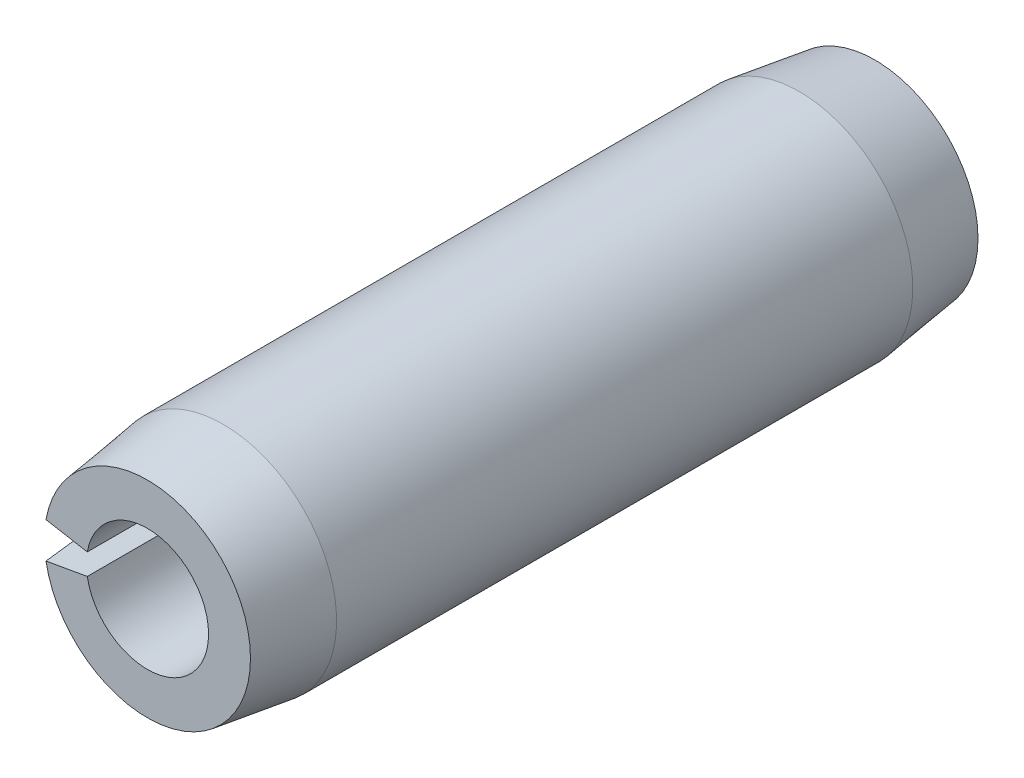
ISO-10303-21;
HEADER;
FILE_DESCRIPTION(('STEP AP214'),'2;1');
FILE_NAME('part.step','',(''),(''),'','','');
FILE_SCHEMA(('AUTOMOTIVE_DESIGN { 1 0 10303 214 1 1 1 1 }'));
ENDSEC;
DATA;
#1=APPLICATION_CONTEXT('core data for automotive mechanical design processes');
#2=APPLICATION_PROTOCOL_DEFINITION('international standard','automotive_design',2000,#1);
#3=PRODUCT_CONTEXT('',#1,'mechanical');
#4=PRODUCT('Part','Part','',(#3));
#5=PRODUCT_RELATED_PRODUCT_CATEGORY('part','',(#4));
#6=PRODUCT_DEFINITION_FORMATION('','',#4);
#7=PRODUCT_DEFINITION_CONTEXT('part definition',#1,'design');
#8=PRODUCT_DEFINITION('design','',#6,#7);
#9=PRODUCT_DEFINITION_SHAPE('','',#8);
#10=(LENGTH_UNIT() NAMED_UNIT(*) SI_UNIT(.MILLI.,.METRE.));
#11=(NAMED_UNIT(*) PLANE_ANGLE_UNIT() SI_UNIT($,.RADIAN.));
#12=(NAMED_UNIT(*) SI_UNIT($,.STERADIAN.) SOLID_ANGLE_UNIT());
#13=UNCERTAINTY_MEASURE_WITH_UNIT(LENGTH_MEASURE(1.E-05),#10,'distance_accuracy_value','');
#14=(GEOMETRIC_REPRESENTATION_CONTEXT(3) GLOBAL_UNCERTAINTY_ASSIGNED_CONTEXT((#13)) GLOBAL_UNIT_ASSIGNED_CONTEXT((#10,
#11,#12)) REPRESENTATION_CONTEXT('',''));
#15=CARTESIAN_POINT('',(0.,0.,0.));
#16=DIRECTION('',(0.,0.,1.));
#17=DIRECTION('',(1.,0.,0.));
#18=AXIS2_PLACEMENT_3D('',#15,#16,#17);
#19=CARTESIAN_POINT('',(0.,0.,3.175));
#20=DIRECTION('',(0.,0.,1.));
#21=DIRECTION('',(1.,0.,0.));
#22=AXIS2_PLACEMENT_3D('',#19,#20,#21);
#23=PLANE('',#22);
#24=CARTESIAN_POINT('',(0.,0.,3.175));
#25=DIRECTION('',(0.,0.,-1.));
#26=DIRECTION('',(-1.,0.,0.));
#27=AXIS2_PLACEMENT_3D('',#24,#25,#26);
#28=CIRCLE('',#27,0.899160000000003);
#29=CARTESIAN_POINT('',(-0.88549973919846,0.156137495430994,3.175));
#30=VERTEX_POINT('',#29);
#31=CARTESIAN_POINT('',(-0.885499739198461,-0.156137495430995,3.175));
#32=VERTEX_POINT('',#31);
#33=EDGE_CURVE('E98',#30,#32,#28,.T.);
#34=ORIENTED_EDGE('',*,*,#33,.F.);
#35=DIRECTION('',(0.984807753012209,-0.173648177666927,0.));
#36=VECTOR('',#35,1.);
#37=CARTESIAN_POINT('',(-0.975550560133894,0.172015884796858,3.175));
#38=LINE('',#37,#36);
#39=CARTESIAN_POINT('',(-0.525296455456712,0.0926239379675387,3.175));
#40=VERTEX_POINT('',#39);
#41=EDGE_CURVE('E122',#30,#40,#38,.T.);
#42=ORIENTED_EDGE('',*,*,#41,.T.);
#43=CARTESIAN_POINT('',(0.,0.,3.175));
#44=DIRECTION('',(0.,0.,-1.));
#45=DIRECTION('',(1.,0.,0.));
#46=AXIS2_PLACEMENT_3D('',#43,#44,#45);
#47=CIRCLE('',#46,0.5334);
#48=CARTESIAN_POINT('',(-0.525296455456712,-0.0926239379675386,3.175));
#49=VERTEX_POINT('',#48);
#50=EDGE_CURVE('E120',#40,#49,#47,.T.);
#51=ORIENTED_EDGE('',*,*,#50,.T.);
#52=DIRECTION('',(-0.984807753012209,-0.173648177666927,0.));
#53=VECTOR('',#52,1.);
#54=CARTESIAN_POINT('',(-0.525296455456712,-0.0926239379675386,3.175));
#55=LINE('',#54,#53);
#56=EDGE_CURVE('E113',#49,#32,#55,.T.);
#57=ORIENTED_EDGE('',*,*,#56,.T.);
#58=EDGE_LOOP('',(#34,#42,#51,#57));
#59=FACE_BOUND('',#58,.T.);
#60=ADVANCED_FACE('F45',(#59),#23,.T.);
#61=CARTESIAN_POINT('',(0.,0.,-3.175));
#62=DIRECTION('',(0.,0.,1.));
#63=DIRECTION('',(1.,0.,0.));
#64=AXIS2_PLACEMENT_3D('',#61,#62,#63);
#65=CYLINDRICAL_SURFACE('',#64,0.5334);
#66=DIRECTION('',(0.,0.,1.));
#67=VECTOR('',#66,1.);
#68=CARTESIAN_POINT('',(-0.525296455456712,-0.0926239379675386,-3.175));
#69=LINE('',#68,#67);
#70=CARTESIAN_POINT('',(-0.525296455456712,-0.0926239379675386,-3.175));
#71=VERTEX_POINT('',#70);
#72=EDGE_CURVE('E49',#71,#49,#69,.T.);
#73=ORIENTED_EDGE('',*,*,#72,.T.);
#74=ORIENTED_EDGE('',*,*,#50,.F.);
#75=DIRECTION('',(0.,0.,1.));
#76=VECTOR('',#75,1.);
#77=CARTESIAN_POINT('',(-0.525296455456712,0.0926239379675387,-3.175));
#78=LINE('',#77,#76);
#79=CARTESIAN_POINT('',(-0.525296455456712,0.0926239379675387,-3.175));
#80=VERTEX_POINT('',#79);
#81=EDGE_CURVE('E12',#80,#40,#78,.T.);
#82=ORIENTED_EDGE('',*,*,#81,.F.);
#83=CARTESIAN_POINT('',(0.,0.,-3.175));
#84=DIRECTION('',(0.,0.,-1.));
#85=DIRECTION('',(1.,0.,0.));
#86=AXIS2_PLACEMENT_3D('',#83,#84,#85);
#87=CIRCLE('',#86,0.5334);
#88=EDGE_CURVE('E127',#80,#71,#87,.T.);
#89=ORIENTED_EDGE('',*,*,#88,.T.);
#90=EDGE_LOOP('',(#73,#74,#82,#89));
#91=FACE_BOUND('',#90,.T.);
#92=ADVANCED_FACE('F47',(#91),#65,.F.);
#93=CARTESIAN_POINT('',(-0.975550560133894,0.172015884796858,-3.175));
#94=DIRECTION('',(-0.173648177666927,-0.984807753012209,0.));
#95=DIRECTION('',(0.984807753012209,-0.173648177666927,0.));
#96=AXIS2_PLACEMENT_3D('',#93,#94,#95);
#97=PLANE('',#96);
#98=DIRECTION('',(-0.135069395335854,0.0238163786656887,-0.990549866766363));
#99=VECTOR('',#98,1.);
#100=CARTESIAN_POINT('',(0.,0.,9.66893333333335));
#101=LINE('',#100,#99);
#102=CARTESIAN_POINT('',(-0.975550560133896,0.172015884796858,2.5146));
#103=VERTEX_POINT('',#102);
#104=EDGE_CURVE('E63',#103,#30,#101,.F.);
#105=ORIENTED_EDGE('',*,*,#104,.F.);
#106=DIRECTION('',(0.,0.,1.));
#107=VECTOR('',#106,1.);
#108=CARTESIAN_POINT('',(-0.975550560133894,0.172015884796858,-3.175));
#109=LINE('',#108,#107);
#110=CARTESIAN_POINT('',(-0.975550560133896,0.172015884796858,-2.5146));
#111=VERTEX_POINT('',#110);
#112=EDGE_CURVE('E55',#111,#103,#109,.T.);
#113=ORIENTED_EDGE('',*,*,#112,.F.);
#114=DIRECTION('',(0.135069395335854,-0.0238163786656887,-0.990549866766363));
#115=VECTOR('',#114,1.);
#116=CARTESIAN_POINT('',(0.,0.,-9.66893333333335));
#117=LINE('',#116,#115);
#118=CARTESIAN_POINT('',(-0.88549973919846,0.156137495430994,-3.175));
#119=VERTEX_POINT('',#118);
#120=EDGE_CURVE('E129',#119,#111,#117,.F.);
#121=ORIENTED_EDGE('',*,*,#120,.F.);
#122=DIRECTION('',(0.984807753012209,-0.173648177666927,0.));
#123=VECTOR('',#122,1.);
#124=CARTESIAN_POINT('',(-0.975550560133894,0.172015884796858,-3.175));
#125=LINE('',#124,#123);
#126=EDGE_CURVE('E140',#119,#80,#125,.T.);
#127=ORIENTED_EDGE('',*,*,#126,.T.);
#128=ORIENTED_EDGE('',*,*,#81,.T.);
#129=ORIENTED_EDGE('',*,*,#41,.F.);
#130=EDGE_LOOP('',(#105,#113,#121,#127,#128,#129));
#131=FACE_BOUND('',#130,.T.);
#132=ADVANCED_FACE('F176',(#131),#97,.T.);
#133=CARTESIAN_POINT('',(0.,0.,-3.175));
#134=DIRECTION('',(0.,0.,1.));
#135=DIRECTION('',(1.,0.,0.));
#136=AXIS2_PLACEMENT_3D('',#133,#134,#135);
#137=CYLINDRICAL_SURFACE('',#136,0.9906);
#138=CARTESIAN_POINT('',(0.,0.,2.5146));
#139=DIRECTION('',(0.,0.,-1.));
#140=DIRECTION('',(-1.,0.,0.));
#141=AXIS2_PLACEMENT_3D('',#138,#139,#140);
#142=CIRCLE('',#141,0.990600000000003);
#143=CARTESIAN_POINT('',(-0.975550560133897,-0.172015884796858,2.5146));
#144=VERTEX_POINT('',#143);
#145=EDGE_CURVE('E107',#103,#144,#142,.T.);
#146=ORIENTED_EDGE('',*,*,#145,.T.);
#147=DIRECTION('',(0.,0.,1.));
#148=VECTOR('',#147,1.);
#149=CARTESIAN_POINT('',(-0.975550560133894,-0.172015884796858,-3.175));
#150=LINE('',#149,#148);
#151=CARTESIAN_POINT('',(-0.975550560133897,-0.172015884796858,-2.5146));
#152=VERTEX_POINT('',#151);
#153=EDGE_CURVE('E116',#152,#144,#150,.T.);
#154=ORIENTED_EDGE('',*,*,#153,.F.);
#155=CARTESIAN_POINT('',(0.,0.,-2.5146));
#156=DIRECTION('',(0.,0.,-1.));
#157=DIRECTION('',(-1.,0.,0.));
#158=AXIS2_PLACEMENT_3D('',#155,#156,#157);
#159=CIRCLE('',#158,0.990600000000003);
#160=EDGE_CURVE('E159',#111,#152,#159,.T.);
#161=ORIENTED_EDGE('',*,*,#160,.F.);
#162=ORIENTED_EDGE('',*,*,#112,.T.);
#163=EDGE_LOOP('',(#146,#154,#161,#162));
#164=FACE_BOUND('',#163,.T.);
#165=ADVANCED_FACE('F175',(#164),#137,.T.);
#166=CARTESIAN_POINT('',(-0.525296455456712,-0.0926239379675386,-3.175));
#167=DIRECTION('',(-0.173648177666927,0.984807753012209,0.));
#168=DIRECTION('',(-0.984807753012209,-0.173648177666927,0.));
#169=AXIS2_PLACEMENT_3D('',#166,#167,#168);
#170=PLANE('',#169);
#171=DIRECTION('',(0.135069395335854,0.0238163786656888,0.990549866766363));
#172=VECTOR('',#171,1.);
#173=CARTESIAN_POINT('',(0.,0.,9.66893333333335));
#174=LINE('',#173,#172);
#175=EDGE_CURVE('E101',#32,#144,#174,.F.);
#176=ORIENTED_EDGE('',*,*,#175,.F.);
#177=ORIENTED_EDGE('',*,*,#56,.F.);
#178=ORIENTED_EDGE('',*,*,#72,.F.);
#179=DIRECTION('',(-0.984807753012209,-0.173648177666927,0.));
#180=VECTOR('',#179,1.);
#181=CARTESIAN_POINT('',(-0.525296455456712,-0.0926239379675386,-3.175));
#182=LINE('',#181,#180);
#183=CARTESIAN_POINT('',(-0.885499739198461,-0.156137495430995,-3.175));
#184=VERTEX_POINT('',#183);
#185=EDGE_CURVE('E136',#71,#184,#182,.T.);
#186=ORIENTED_EDGE('',*,*,#185,.T.);
#187=DIRECTION('',(-0.135069395335854,-0.0238163786656888,0.990549866766363));
#188=VECTOR('',#187,1.);
#189=CARTESIAN_POINT('',(0.,0.,-9.66893333333335));
#190=LINE('',#189,#188);
#191=EDGE_CURVE('E71',#152,#184,#190,.F.);
#192=ORIENTED_EDGE('',*,*,#191,.F.);
#193=ORIENTED_EDGE('',*,*,#153,.T.);
#194=EDGE_LOOP('',(#176,#177,#178,#186,#192,#193));
#195=FACE_BOUND('',#194,.T.);
#196=ADVANCED_FACE('F112',(#195),#170,.T.);
#197=CARTESIAN_POINT('',(0.,0.,-3.175));
#198=DIRECTION('',(0.,0.,1.));
#199=DIRECTION('',(1.,0.,0.));
#200=AXIS2_PLACEMENT_3D('',#197,#198,#199);
#201=PLANE('',#200);
#202=ORIENTED_EDGE('',*,*,#126,.F.);
#203=CARTESIAN_POINT('',(0.,0.,-3.175));
#204=DIRECTION('',(0.,0.,-1.));
#205=DIRECTION('',(-1.,0.,0.));
#206=AXIS2_PLACEMENT_3D('',#203,#204,#205);
#207=CIRCLE('',#206,0.899160000000003);
#208=EDGE_CURVE('E156',#119,#184,#207,.T.);
#209=ORIENTED_EDGE('',*,*,#208,.T.);
#210=ORIENTED_EDGE('',*,*,#185,.F.);
#211=ORIENTED_EDGE('',*,*,#88,.F.);
#212=EDGE_LOOP('',(#202,#209,#210,#211));
#213=FACE_BOUND('',#212,.T.);
#214=ADVANCED_FACE('F155',(#213),#201,.F.);
#215=CARTESIAN_POINT('',(0.,0.,-2.5146));
#216=DIRECTION('',(0.,0.,1.));
#217=DIRECTION('',(1.,0.,0.));
#218=AXIS2_PLACEMENT_3D('',#215,#216,#217);
#219=CONICAL_SURFACE('',#218,0.990600000000003,0.13758673647035);
#220=ORIENTED_EDGE('',*,*,#120,.T.);
#221=ORIENTED_EDGE('',*,*,#160,.T.);
#222=ORIENTED_EDGE('',*,*,#191,.T.);
#223=ORIENTED_EDGE('',*,*,#208,.F.);
#224=EDGE_LOOP('',(#220,#221,#222,#223));
#225=FACE_BOUND('',#224,.T.);
#226=ADVANCED_FACE('F171',(#225),#219,.T.);
#227=CARTESIAN_POINT('',(0.,0.,2.5146));
#228=DIRECTION('',(0.,0.,-1.));
#229=DIRECTION('',(1.,0.,0.));
#230=AXIS2_PLACEMENT_3D('',#227,#228,#229);
#231=CONICAL_SURFACE('',#230,0.990600000000003,0.13758673647035);
#232=ORIENTED_EDGE('',*,*,#104,.T.);
#233=ORIENTED_EDGE('',*,*,#33,.T.);
#234=ORIENTED_EDGE('',*,*,#175,.T.);
#235=ORIENTED_EDGE('',*,*,#145,.F.);
#236=EDGE_LOOP('',(#232,#233,#234,#235));
#237=FACE_BOUND('',#236,.T.);
#238=ADVANCED_FACE('F100',(#237),#231,.T.);
#239=CLOSED_SHELL('',(#60,#92,#132,#165,#196,#214,#226,#238));
#240=MANIFOLD_SOLID_BREP('B2',#239);
#241=ADVANCED_BREP_SHAPE_REPRESENTATION('',(#18,#240),#14);
#242=SHAPE_DEFINITION_REPRESENTATION(#9,#241);
ENDSEC;
END-ISO-10303-21;
